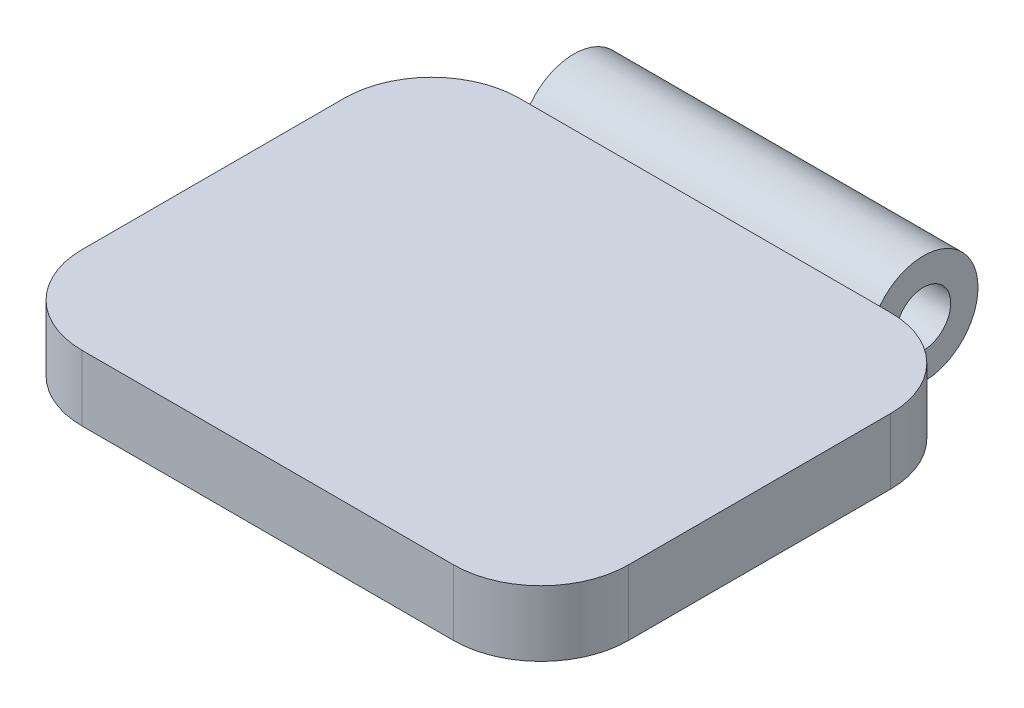
ISO-10303-21;
HEADER;
FILE_DESCRIPTION(('STEP AP214'),'2;1');
FILE_NAME('part.step','',(''),(''),'','','');
FILE_SCHEMA(('AUTOMOTIVE_DESIGN { 1 0 10303 214 1 1 1 1 }'));
ENDSEC;
DATA;
#1=APPLICATION_CONTEXT('core data for automotive mechanical design processes');
#2=APPLICATION_PROTOCOL_DEFINITION('international standard','automotive_design',2000,#1);
#3=PRODUCT_CONTEXT('',#1,'mechanical');
#4=PRODUCT('Part','Part','',(#3));
#5=PRODUCT_RELATED_PRODUCT_CATEGORY('part','',(#4));
#6=PRODUCT_DEFINITION_FORMATION('','',#4);
#7=PRODUCT_DEFINITION_CONTEXT('part definition',#1,'design');
#8=PRODUCT_DEFINITION('design','',#6,#7);
#9=PRODUCT_DEFINITION_SHAPE('','',#8);
#10=(LENGTH_UNIT() NAMED_UNIT(*) SI_UNIT(.MILLI.,.METRE.));
#11=(NAMED_UNIT(*) PLANE_ANGLE_UNIT() SI_UNIT($,.RADIAN.));
#12=(NAMED_UNIT(*) SI_UNIT($,.STERADIAN.) SOLID_ANGLE_UNIT());
#13=UNCERTAINTY_MEASURE_WITH_UNIT(LENGTH_MEASURE(1.E-05),#10,'distance_accuracy_value','');
#14=(GEOMETRIC_REPRESENTATION_CONTEXT(3) GLOBAL_UNCERTAINTY_ASSIGNED_CONTEXT((#13)) GLOBAL_UNIT_ASSIGNED_CONTEXT((#10,
#11,#12)) REPRESENTATION_CONTEXT('',''));
#15=CARTESIAN_POINT('',(0.,0.,0.));
#16=DIRECTION('',(0.,0.,1.));
#17=DIRECTION('',(1.,0.,0.));
#18=AXIS2_PLACEMENT_3D('',#15,#16,#17);
#19=CARTESIAN_POINT('',(-12.5,3.,-10.));
#20=DIRECTION('',(0.,0.,1.));
#21=DIRECTION('',(1.,0.,0.));
#22=AXIS2_PLACEMENT_3D('',#19,#20,#21);
#23=PLANE('',#22);
#24=DIRECTION('',(0.,1.,0.));
#25=VECTOR('',#24,1.);
#26=CARTESIAN_POINT('',(-8.,3.,-10.));
#27=LINE('',#26,#25);
#28=CARTESIAN_POINT('',(-8.,0.,-10.));
#29=VERTEX_POINT('',#28);
#30=CARTESIAN_POINT('',(-8.,3.,-10.));
#31=VERTEX_POINT('',#30);
#32=EDGE_CURVE('E129',#29,#31,#27,.T.);
#33=ORIENTED_EDGE('',*,*,#32,.F.);
#34=DIRECTION('',(-1.,0.,0.));
#35=VECTOR('',#34,1.);
#36=CARTESIAN_POINT('',(-12.5,0.,-10.));
#37=LINE('',#36,#35);
#38=CARTESIAN_POINT('',(-8.5,0.,-10.));
#39=VERTEX_POINT('',#38);
#40=EDGE_CURVE('E117',#29,#39,#37,.T.);
#41=ORIENTED_EDGE('',*,*,#40,.T.);
#42=DIRECTION('',(0.,-1.,0.));
#43=VECTOR('',#42,1.);
#44=CARTESIAN_POINT('',(-8.5,3.,-10.));
#45=LINE('',#44,#43);
#46=CARTESIAN_POINT('',(-8.5,3.,-10.));
#47=VERTEX_POINT('',#46);
#48=EDGE_CURVE('E187',#39,#47,#45,.F.);
#49=ORIENTED_EDGE('',*,*,#48,.T.);
#50=DIRECTION('',(-1.,0.,0.));
#51=VECTOR('',#50,1.);
#52=CARTESIAN_POINT('',(-12.5,3.,-10.));
#53=LINE('',#52,#51);
#54=EDGE_CURVE('E54',#31,#47,#53,.T.);
#55=ORIENTED_EDGE('',*,*,#54,.F.);
#56=EDGE_LOOP('',(#33,#41,#49,#55));
#57=FACE_BOUND('',#56,.T.);
#58=ADVANCED_FACE('F39',(#57),#23,.F.);
#59=CARTESIAN_POINT('',(12.5,3.,10.));
#60=DIRECTION('',(-1.,0.,0.));
#61=DIRECTION('',(0.,0.,1.));
#62=AXIS2_PLACEMENT_3D('',#59,#60,#61);
#63=PLANE('',#62);
#64=DIRECTION('',(0.,0.,-1.));
#65=VECTOR('',#64,1.);
#66=CARTESIAN_POINT('',(12.5,0.,10.));
#67=LINE('',#66,#65);
#68=CARTESIAN_POINT('',(12.5,0.,6.));
#69=VERTEX_POINT('',#68);
#70=CARTESIAN_POINT('',(12.5,0.,-6.));
#71=VERTEX_POINT('',#70);
#72=EDGE_CURVE('E125',#69,#71,#67,.T.);
#73=ORIENTED_EDGE('',*,*,#72,.T.);
#74=DIRECTION('',(0.,-1.,0.));
#75=VECTOR('',#74,1.);
#76=CARTESIAN_POINT('',(12.5,3.,-6.));
#77=LINE('',#76,#75);
#78=CARTESIAN_POINT('',(12.5,3.,-6.));
#79=VERTEX_POINT('',#78);
#80=EDGE_CURVE('E11',#71,#79,#77,.F.);
#81=ORIENTED_EDGE('',*,*,#80,.T.);
#82=DIRECTION('',(0.,0.,-1.));
#83=VECTOR('',#82,1.);
#84=CARTESIAN_POINT('',(12.5,3.,10.));
#85=LINE('',#84,#83);
#86=CARTESIAN_POINT('',(12.5,3.,6.));
#87=VERTEX_POINT('',#86);
#88=EDGE_CURVE('E153',#87,#79,#85,.T.);
#89=ORIENTED_EDGE('',*,*,#88,.F.);
#90=DIRECTION('',(0.,-1.,0.));
#91=VECTOR('',#90,1.);
#92=CARTESIAN_POINT('',(12.5,3.,6.));
#93=LINE('',#92,#91);
#94=EDGE_CURVE('E47',#87,#69,#93,.T.);
#95=ORIENTED_EDGE('',*,*,#94,.T.);
#96=EDGE_LOOP('',(#73,#81,#89,#95));
#97=FACE_BOUND('',#96,.T.);
#98=ADVANCED_FACE('F206',(#97),#63,.F.);
#99=CARTESIAN_POINT('',(8.49999999999999,0.,-10.));
#100=VERTEX_POINT('',#99);
#101=CARTESIAN_POINT('',(7.99999999999999,0.,-10.));
#102=VERTEX_POINT('',#101);
#103=EDGE_CURVE('E127',#100,#102,#37,.T.);
#104=ORIENTED_EDGE('',*,*,#103,.T.);
#105=DIRECTION('',(0.,1.,0.));
#106=VECTOR('',#105,1.);
#107=CARTESIAN_POINT('',(8.,3.,-10.));
#108=LINE('',#107,#106);
#109=CARTESIAN_POINT('',(7.99999999999999,3.,-10.));
#110=VERTEX_POINT('',#109);
#111=EDGE_CURVE('E62',#102,#110,#108,.T.);
#112=ORIENTED_EDGE('',*,*,#111,.T.);
#113=CARTESIAN_POINT('',(8.49999999999999,3.,-10.));
#114=VERTEX_POINT('',#113);
#115=EDGE_CURVE('E157',#114,#110,#53,.T.);
#116=ORIENTED_EDGE('',*,*,#115,.F.);
#117=DIRECTION('',(0.,-1.,0.));
#118=VECTOR('',#117,1.);
#119=CARTESIAN_POINT('',(8.5,3.,-10.));
#120=LINE('',#119,#118);
#121=EDGE_CURVE('E184',#114,#100,#120,.T.);
#122=ORIENTED_EDGE('',*,*,#121,.T.);
#123=EDGE_LOOP('',(#104,#112,#116,#122));
#124=FACE_BOUND('',#123,.T.);
#125=ADVANCED_FACE('F215',(#124),#23,.F.);
#126=CARTESIAN_POINT('',(-12.5,3.,10.));
#127=DIRECTION('',(1.,0.,0.));
#128=DIRECTION('',(0.,0.,-1.));
#129=AXIS2_PLACEMENT_3D('',#126,#127,#128);
#130=PLANE('',#129);
#131=DIRECTION('',(0.,0.,1.));
#132=VECTOR('',#131,1.);
#133=CARTESIAN_POINT('',(-12.5,3.,10.));
#134=LINE('',#133,#132);
#135=CARTESIAN_POINT('',(-12.5,3.,-6.));
#136=VERTEX_POINT('',#135);
#137=CARTESIAN_POINT('',(-12.5,3.,6.));
#138=VERTEX_POINT('',#137);
#139=EDGE_CURVE('E159',#136,#138,#134,.T.);
#140=ORIENTED_EDGE('',*,*,#139,.F.);
#141=DIRECTION('',(0.,-1.,0.));
#142=VECTOR('',#141,1.);
#143=CARTESIAN_POINT('',(-12.5,3.,-6.));
#144=LINE('',#143,#142);
#145=CARTESIAN_POINT('',(-12.5,0.,-6.));
#146=VERTEX_POINT('',#145);
#147=EDGE_CURVE('E174',#136,#146,#144,.T.);
#148=ORIENTED_EDGE('',*,*,#147,.T.);
#149=DIRECTION('',(0.,0.,1.));
#150=VECTOR('',#149,1.);
#151=CARTESIAN_POINT('',(-12.5,0.,10.));
#152=LINE('',#151,#150);
#153=CARTESIAN_POINT('',(-12.5,0.,6.));
#154=VERTEX_POINT('',#153);
#155=EDGE_CURVE('E168',#146,#154,#152,.T.);
#156=ORIENTED_EDGE('',*,*,#155,.T.);
#157=DIRECTION('',(0.,-1.,0.));
#158=VECTOR('',#157,1.);
#159=CARTESIAN_POINT('',(-12.5,3.,6.));
#160=LINE('',#159,#158);
#161=EDGE_CURVE('E165',#154,#138,#160,.F.);
#162=ORIENTED_EDGE('',*,*,#161,.T.);
#163=EDGE_LOOP('',(#140,#148,#156,#162));
#164=FACE_BOUND('',#163,.T.);
#165=ADVANCED_FACE('F242',(#164),#130,.F.);
#166=CARTESIAN_POINT('',(-12.5,3.,10.));
#167=DIRECTION('',(0.,0.,-1.));
#168=DIRECTION('',(-1.,0.,0.));
#169=AXIS2_PLACEMENT_3D('',#166,#167,#168);
#170=PLANE('',#169);
#171=DIRECTION('',(1.,0.,0.));
#172=VECTOR('',#171,1.);
#173=CARTESIAN_POINT('',(-12.5,3.,10.));
#174=LINE('',#173,#172);
#175=CARTESIAN_POINT('',(-8.5,3.,10.));
#176=VERTEX_POINT('',#175);
#177=CARTESIAN_POINT('',(8.49999999999999,3.,10.));
#178=VERTEX_POINT('',#177);
#179=EDGE_CURVE('E162',#176,#178,#174,.T.);
#180=ORIENTED_EDGE('',*,*,#179,.F.);
#181=DIRECTION('',(0.,-1.,0.));
#182=VECTOR('',#181,1.);
#183=CARTESIAN_POINT('',(-8.5,3.,10.));
#184=LINE('',#183,#182);
#185=CARTESIAN_POINT('',(-8.5,0.,10.));
#186=VERTEX_POINT('',#185);
#187=EDGE_CURVE('E199',#176,#186,#184,.T.);
#188=ORIENTED_EDGE('',*,*,#187,.T.);
#189=DIRECTION('',(1.,0.,0.));
#190=VECTOR('',#189,1.);
#191=CARTESIAN_POINT('',(-12.5,0.,10.));
#192=LINE('',#191,#190);
#193=CARTESIAN_POINT('',(8.49999999999999,0.,10.));
#194=VERTEX_POINT('',#193);
#195=EDGE_CURVE('E156',#186,#194,#192,.T.);
#196=ORIENTED_EDGE('',*,*,#195,.T.);
#197=DIRECTION('',(0.,-1.,0.));
#198=VECTOR('',#197,1.);
#199=CARTESIAN_POINT('',(8.5,3.,10.));
#200=LINE('',#199,#198);
#201=EDGE_CURVE('E197',#194,#178,#200,.F.);
#202=ORIENTED_EDGE('',*,*,#201,.T.);
#203=EDGE_LOOP('',(#180,#188,#196,#202));
#204=FACE_BOUND('',#203,.T.);
#205=ADVANCED_FACE('F247',(#204),#170,.F.);
#206=CARTESIAN_POINT('',(0.,3.,0.));
#207=DIRECTION('',(0.,-1.,0.));
#208=DIRECTION('',(0.,0.,-1.));
#209=AXIS2_PLACEMENT_3D('',#206,#207,#208);
#210=PLANE('',#209);
#211=ORIENTED_EDGE('',*,*,#115,.T.);
#212=DIRECTION('',(-1.,0.,0.));
#213=VECTOR('',#212,1.);
#214=CARTESIAN_POINT('',(8.,3.,-10.));
#215=LINE('',#214,#213);
#216=EDGE_CURVE('E151',#31,#110,#215,.F.);
#217=ORIENTED_EDGE('',*,*,#216,.F.);
#218=ORIENTED_EDGE('',*,*,#54,.T.);
#219=CARTESIAN_POINT('',(-8.5,3.,-6.));
#220=DIRECTION('',(0.,-1.,0.));
#221=DIRECTION('',(0.,0.,-1.));
#222=AXIS2_PLACEMENT_3D('',#219,#220,#221);
#223=CIRCLE('',#222,4.);
#224=EDGE_CURVE('E195',#47,#136,#223,.F.);
#225=ORIENTED_EDGE('',*,*,#224,.T.);
#226=ORIENTED_EDGE('',*,*,#139,.T.);
#227=CARTESIAN_POINT('',(-8.5,3.,6.));
#228=DIRECTION('',(0.,-1.,0.));
#229=DIRECTION('',(0.,0.,-1.));
#230=AXIS2_PLACEMENT_3D('',#227,#228,#229);
#231=CIRCLE('',#230,4.);
#232=EDGE_CURVE('E193',#138,#176,#231,.F.);
#233=ORIENTED_EDGE('',*,*,#232,.T.);
#234=ORIENTED_EDGE('',*,*,#179,.T.);
#235=CARTESIAN_POINT('',(8.5,3.,6.));
#236=DIRECTION('',(0.,-1.,0.));
#237=DIRECTION('',(0.,0.,-1.));
#238=AXIS2_PLACEMENT_3D('',#235,#236,#237);
#239=CIRCLE('',#238,4.);
#240=EDGE_CURVE('E189',#178,#87,#239,.F.);
#241=ORIENTED_EDGE('',*,*,#240,.T.);
#242=ORIENTED_EDGE('',*,*,#88,.T.);
#243=CARTESIAN_POINT('',(8.5,3.,-6.));
#244=DIRECTION('',(0.,-1.,0.));
#245=DIRECTION('',(0.,0.,-1.));
#246=AXIS2_PLACEMENT_3D('',#243,#244,#245);
#247=CIRCLE('',#246,4.);
#248=EDGE_CURVE('E191',#79,#114,#247,.F.);
#249=ORIENTED_EDGE('',*,*,#248,.T.);
#250=EDGE_LOOP('',(#211,#217,#218,#225,#226,#233,#234,#241,#242,#249));
#251=FACE_BOUND('',#250,.T.);
#252=ADVANCED_FACE('F217',(#251),#210,.F.);
#253=CARTESIAN_POINT('',(0.,0.,0.));
#254=DIRECTION('',(0.,-1.,0.));
#255=DIRECTION('',(0.,0.,-1.));
#256=AXIS2_PLACEMENT_3D('',#253,#254,#255);
#257=PLANE('',#256);
#258=ORIENTED_EDGE('',*,*,#155,.F.);
#259=CARTESIAN_POINT('',(-8.5,0.,-6.));
#260=DIRECTION('',(0.,-1.,0.));
#261=DIRECTION('',(0.,0.,-1.));
#262=AXIS2_PLACEMENT_3D('',#259,#260,#261);
#263=CIRCLE('',#262,4.);
#264=EDGE_CURVE('E123',#146,#39,#263,.T.);
#265=ORIENTED_EDGE('',*,*,#264,.T.);
#266=ORIENTED_EDGE('',*,*,#40,.F.);
#267=EDGE_CURVE('E122',#102,#29,#37,.T.);
#268=ORIENTED_EDGE('',*,*,#267,.F.);
#269=ORIENTED_EDGE('',*,*,#103,.F.);
#270=CARTESIAN_POINT('',(8.5,0.,-6.));
#271=DIRECTION('',(0.,-1.,0.));
#272=DIRECTION('',(0.,0.,-1.));
#273=AXIS2_PLACEMENT_3D('',#270,#271,#272);
#274=CIRCLE('',#273,4.);
#275=EDGE_CURVE('E179',#100,#71,#274,.T.);
#276=ORIENTED_EDGE('',*,*,#275,.T.);
#277=ORIENTED_EDGE('',*,*,#72,.F.);
#278=CARTESIAN_POINT('',(8.5,0.,6.));
#279=DIRECTION('',(0.,-1.,0.));
#280=DIRECTION('',(0.,0.,-1.));
#281=AXIS2_PLACEMENT_3D('',#278,#279,#280);
#282=CIRCLE('',#281,4.);
#283=EDGE_CURVE('E177',#69,#194,#282,.T.);
#284=ORIENTED_EDGE('',*,*,#283,.T.);
#285=ORIENTED_EDGE('',*,*,#195,.F.);
#286=CARTESIAN_POINT('',(-8.5,0.,6.));
#287=DIRECTION('',(0.,-1.,0.));
#288=DIRECTION('',(0.,0.,-1.));
#289=AXIS2_PLACEMENT_3D('',#286,#287,#288);
#290=CIRCLE('',#289,4.);
#291=EDGE_CURVE('E181',#186,#154,#290,.T.);
#292=ORIENTED_EDGE('',*,*,#291,.T.);
#293=EDGE_LOOP('',(#258,#265,#266,#268,#269,#276,#277,#284,#285,#292));
#294=FACE_BOUND('',#293,.T.);
#295=ADVANCED_FACE('F119',(#294),#257,.T.);
#296=CARTESIAN_POINT('',(-8.5,3.,-6.));
#297=DIRECTION('',(0.,-1.,0.));
#298=DIRECTION('',(0.,0.,-1.));
#299=AXIS2_PLACEMENT_3D('',#296,#297,#298);
#300=CYLINDRICAL_SURFACE('',#299,4.);
#301=ORIENTED_EDGE('',*,*,#224,.F.);
#302=ORIENTED_EDGE('',*,*,#48,.F.);
#303=ORIENTED_EDGE('',*,*,#264,.F.);
#304=ORIENTED_EDGE('',*,*,#147,.F.);
#305=EDGE_LOOP('',(#301,#302,#303,#304));
#306=FACE_BOUND('',#305,.T.);
#307=ADVANCED_FACE('F258',(#306),#300,.T.);
#308=CARTESIAN_POINT('',(-8.5,3.,6.));
#309=DIRECTION('',(0.,-1.,0.));
#310=DIRECTION('',(0.,0.,-1.));
#311=AXIS2_PLACEMENT_3D('',#308,#309,#310);
#312=CYLINDRICAL_SURFACE('',#311,4.);
#313=ORIENTED_EDGE('',*,*,#232,.F.);
#314=ORIENTED_EDGE('',*,*,#161,.F.);
#315=ORIENTED_EDGE('',*,*,#291,.F.);
#316=ORIENTED_EDGE('',*,*,#187,.F.);
#317=EDGE_LOOP('',(#313,#314,#315,#316));
#318=FACE_BOUND('',#317,.T.);
#319=ADVANCED_FACE('F314',(#318),#312,.T.);
#320=CARTESIAN_POINT('',(8.5,3.,-6.));
#321=DIRECTION('',(0.,-1.,0.));
#322=DIRECTION('',(0.,0.,-1.));
#323=AXIS2_PLACEMENT_3D('',#320,#321,#322);
#324=CYLINDRICAL_SURFACE('',#323,4.);
#325=ORIENTED_EDGE('',*,*,#248,.F.);
#326=ORIENTED_EDGE('',*,*,#80,.F.);
#327=ORIENTED_EDGE('',*,*,#275,.F.);
#328=ORIENTED_EDGE('',*,*,#121,.F.);
#329=EDGE_LOOP('',(#325,#326,#327,#328));
#330=FACE_BOUND('',#329,.T.);
#331=ADVANCED_FACE('F214',(#330),#324,.T.);
#332=CARTESIAN_POINT('',(8.5,3.,6.));
#333=DIRECTION('',(0.,-1.,0.));
#334=DIRECTION('',(0.,0.,-1.));
#335=AXIS2_PLACEMENT_3D('',#332,#333,#334);
#336=CYLINDRICAL_SURFACE('',#335,4.);
#337=ORIENTED_EDGE('',*,*,#240,.F.);
#338=ORIENTED_EDGE('',*,*,#201,.F.);
#339=ORIENTED_EDGE('',*,*,#283,.F.);
#340=ORIENTED_EDGE('',*,*,#94,.F.);
#341=EDGE_LOOP('',(#337,#338,#339,#340));
#342=FACE_BOUND('',#341,.T.);
#343=ADVANCED_FACE('F41',(#342),#336,.T.);
#344=CARTESIAN_POINT('',(8.,1.5,-12.));
#345=DIRECTION('',(-1.,0.,0.));
#346=DIRECTION('',(0.,0.,1.));
#347=AXIS2_PLACEMENT_3D('',#344,#345,#346);
#348=CYLINDRICAL_SURFACE('',#347,2.5);
#349=CARTESIAN_POINT('',(-8.,1.5,-12.));
#350=DIRECTION('',(1.,0.,0.));
#351=DIRECTION('',(0.,0.,-1.));
#352=AXIS2_PLACEMENT_3D('',#349,#350,#351);
#353=CIRCLE('',#352,2.5);
#354=EDGE_CURVE('E139',#29,#31,#353,.T.);
#355=ORIENTED_EDGE('',*,*,#354,.T.);
#356=ORIENTED_EDGE('',*,*,#216,.T.);
#357=CARTESIAN_POINT('',(8.,1.5,-12.));
#358=DIRECTION('',(1.,0.,0.));
#359=DIRECTION('',(0.,0.,-1.));
#360=AXIS2_PLACEMENT_3D('',#357,#358,#359);
#361=CIRCLE('',#360,2.5);
#362=EDGE_CURVE('E133',#102,#110,#361,.T.);
#363=ORIENTED_EDGE('',*,*,#362,.F.);
#364=ORIENTED_EDGE('',*,*,#267,.T.);
#365=EDGE_LOOP('',(#355,#356,#363,#364));
#366=FACE_BOUND('',#365,.T.);
#367=ADVANCED_FACE('F137',(#366),#348,.T.);
#368=CARTESIAN_POINT('',(8.,1.5,-12.));
#369=DIRECTION('',(1.,0.,0.));
#370=DIRECTION('',(0.,0.,-1.));
#371=AXIS2_PLACEMENT_3D('',#368,#369,#370);
#372=PLANE('',#371);
#373=CARTESIAN_POINT('',(8.,1.5,-12.));
#374=DIRECTION('',(1.,0.,0.));
#375=DIRECTION('',(0.,0.,-1.));
#376=AXIS2_PLACEMENT_3D('',#373,#374,#375);
#377=CIRCLE('',#376,1.25);
#378=CARTESIAN_POINT('',(8.,1.5,-13.25));
#379=VERTEX_POINT('',#378);
#380=EDGE_CURVE('E146',#379,#379,#377,.T.);
#381=ORIENTED_EDGE('',*,*,#380,.F.);
#382=EDGE_LOOP('',(#381));
#383=FACE_BOUND('',#382,.T.);
#384=ORIENTED_EDGE('',*,*,#111,.F.);
#385=ORIENTED_EDGE('',*,*,#362,.T.);
#386=EDGE_LOOP('',(#384,#385));
#387=FACE_BOUND('',#386,.T.);
#388=ADVANCED_FACE('F219',(#383,#387),#372,.T.);
#389=CARTESIAN_POINT('',(-8.,1.5,-12.));
#390=DIRECTION('',(1.,0.,0.));
#391=DIRECTION('',(0.,0.,-1.));
#392=AXIS2_PLACEMENT_3D('',#389,#390,#391);
#393=PLANE('',#392);
#394=CARTESIAN_POINT('',(-8.,1.5,-12.));
#395=DIRECTION('',(1.,0.,0.));
#396=DIRECTION('',(0.,0.,-1.));
#397=AXIS2_PLACEMENT_3D('',#394,#395,#396);
#398=CIRCLE('',#397,1.25);
#399=CARTESIAN_POINT('',(-8.,1.5,-13.25));
#400=VERTEX_POINT('',#399);
#401=EDGE_CURVE('E142',#400,#400,#398,.T.);
#402=ORIENTED_EDGE('',*,*,#401,.T.);
#403=EDGE_LOOP('',(#402));
#404=FACE_BOUND('',#403,.T.);
#405=ORIENTED_EDGE('',*,*,#354,.F.);
#406=ORIENTED_EDGE('',*,*,#32,.T.);
#407=EDGE_LOOP('',(#405,#406));
#408=FACE_BOUND('',#407,.T.);
#409=ADVANCED_FACE('F141',(#404,#408),#393,.F.);
#410=CARTESIAN_POINT('',(-8.,1.5,-12.));
#411=DIRECTION('',(1.,0.,0.));
#412=DIRECTION('',(0.,0.,-1.));
#413=AXIS2_PLACEMENT_3D('',#410,#411,#412);
#414=CYLINDRICAL_SURFACE('',#413,1.25);
#415=ORIENTED_EDGE('',*,*,#401,.F.);
#416=EDGE_LOOP('',(#415));
#417=FACE_BOUND('',#416,.T.);
#418=ORIENTED_EDGE('',*,*,#380,.T.);
#419=EDGE_LOOP('',(#418));
#420=FACE_BOUND('',#419,.T.);
#421=ADVANCED_FACE('F227',(#417,#420),#414,.F.);
#422=CLOSED_SHELL('',(#58,#98,#125,#165,#205,#252,#295,#307,#319,#331,#343,#367,#388,#409,#421));
#423=MANIFOLD_SOLID_BREP('B2',#422);
#424=ADVANCED_BREP_SHAPE_REPRESENTATION('',(#18,#423),#14);
#425=SHAPE_DEFINITION_REPRESENTATION(#9,#424);
ENDSEC;
END-ISO-10303-21;
